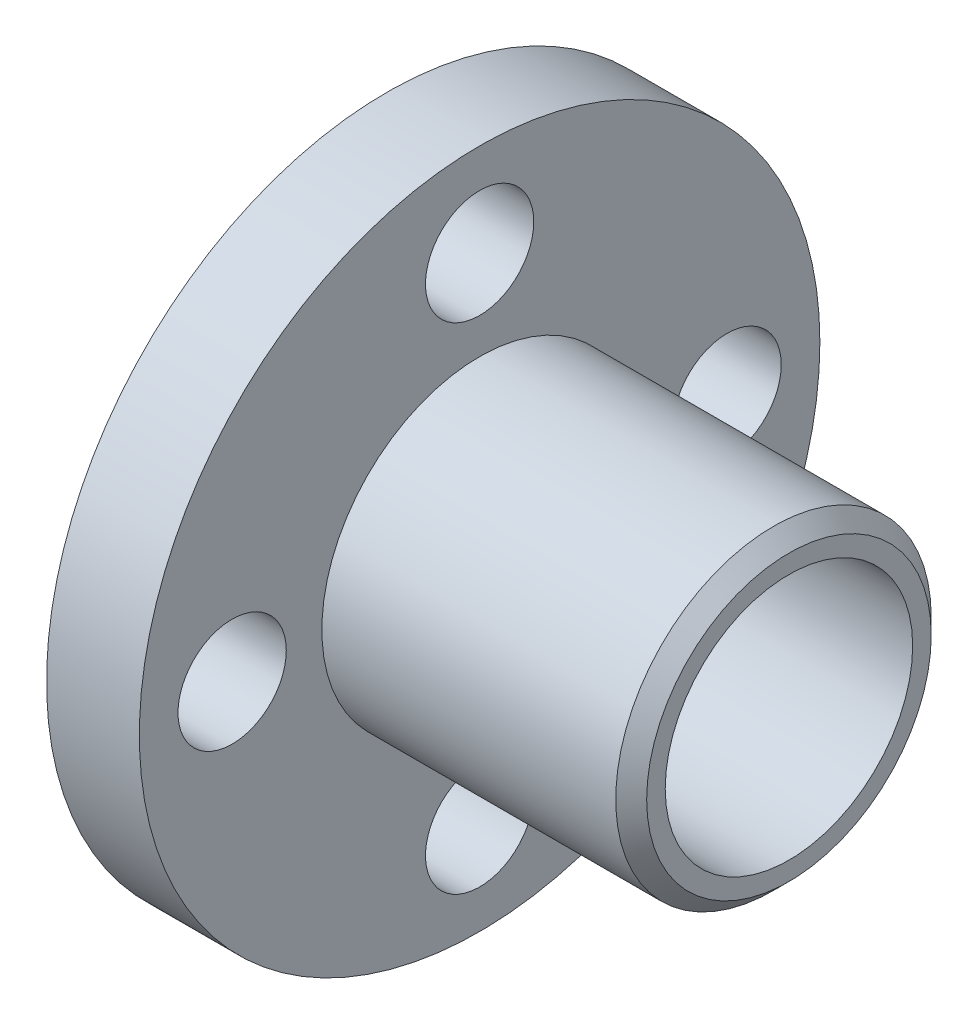
ISO-10303-21;
HEADER;
FILE_DESCRIPTION(('STEP AP214'),'2;1');
FILE_NAME('part.step','',(''),(''),'','','');
FILE_SCHEMA(('AUTOMOTIVE_DESIGN { 1 0 10303 214 1 1 1 1 }'));
ENDSEC;
DATA;
#1=APPLICATION_CONTEXT('core data for automotive mechanical design processes');
#2=APPLICATION_PROTOCOL_DEFINITION('international standard','automotive_design',2000,#1);
#3=PRODUCT_CONTEXT('',#1,'mechanical');
#4=PRODUCT('Part','Part','',(#3));
#5=PRODUCT_RELATED_PRODUCT_CATEGORY('part','',(#4));
#6=PRODUCT_DEFINITION_FORMATION('','',#4);
#7=PRODUCT_DEFINITION_CONTEXT('part definition',#1,'design');
#8=PRODUCT_DEFINITION('design','',#6,#7);
#9=PRODUCT_DEFINITION_SHAPE('','',#8);
#10=(LENGTH_UNIT() NAMED_UNIT(*) SI_UNIT(.MILLI.,.METRE.));
#11=(NAMED_UNIT(*) PLANE_ANGLE_UNIT() SI_UNIT($,.RADIAN.));
#12=(NAMED_UNIT(*) SI_UNIT($,.STERADIAN.) SOLID_ANGLE_UNIT());
#13=UNCERTAINTY_MEASURE_WITH_UNIT(LENGTH_MEASURE(1.E-05),#10,'distance_accuracy_value','');
#14=(GEOMETRIC_REPRESENTATION_CONTEXT(3) GLOBAL_UNCERTAINTY_ASSIGNED_CONTEXT((#13)) GLOBAL_UNIT_ASSIGNED_CONTEXT((#10,
#11,#12)) REPRESENTATION_CONTEXT('',''));
#15=CARTESIAN_POINT('',(0.,0.,0.));
#16=DIRECTION('',(0.,0.,1.));
#17=DIRECTION('',(1.,0.,0.));
#18=AXIS2_PLACEMENT_3D('',#15,#16,#17);
#19=CARTESIAN_POINT('',(0.,0.,0.));
#20=DIRECTION('',(1.,0.,0.));
#21=DIRECTION('',(0.,0.,-1.));
#22=AXIS2_PLACEMENT_3D('',#19,#20,#21);
#23=PLANE('',#22);
#24=CARTESIAN_POINT('',(0.,-2.27373675443232E-13,7.99999999999977));
#25=DIRECTION('',(1.,0.,0.));
#26=DIRECTION('',(0.,0.,-1.));
#27=AXIS2_PLACEMENT_3D('',#24,#25,#26);
#28=CIRCLE('',#27,1.75000000000037);
#29=CARTESIAN_POINT('',(0.,-2.27373675443232E-13,6.24999999999941));
#30=VERTEX_POINT('',#29);
#31=EDGE_CURVE('E72',#30,#30,#28,.T.);
#32=ORIENTED_EDGE('',*,*,#31,.T.);
#33=EDGE_LOOP('',(#32));
#34=FACE_BOUND('',#33,.T.);
#35=CARTESIAN_POINT('',(0.,2.26393958003914E-13,-8.00000000000023));
#36=DIRECTION('',(1.,0.,0.));
#37=DIRECTION('',(0.,0.,-1.));
#38=AXIS2_PLACEMENT_3D('',#35,#36,#37);
#39=CIRCLE('',#38,1.75000000000018);
#40=CARTESIAN_POINT('',(0.,2.26393958003914E-13,-9.75000000000041));
#41=VERTEX_POINT('',#40);
#42=EDGE_CURVE('E60',#41,#41,#39,.T.);
#43=ORIENTED_EDGE('',*,*,#42,.T.);
#44=EDGE_LOOP('',(#43));
#45=FACE_BOUND('',#44,.T.);
#46=CARTESIAN_POINT('',(0.,0.,0.));
#47=DIRECTION('',(1.,0.,0.));
#48=DIRECTION('',(0.,0.,-1.));
#49=AXIS2_PLACEMENT_3D('',#46,#47,#48);
#50=CIRCLE('',#49,11.);
#51=CARTESIAN_POINT('',(0.,0.,-11.));
#52=VERTEX_POINT('',#51);
#53=EDGE_CURVE('E48',#52,#52,#50,.T.);
#54=ORIENTED_EDGE('',*,*,#53,.F.);
#55=EDGE_LOOP('',(#54));
#56=FACE_BOUND('',#55,.T.);
#57=CARTESIAN_POINT('',(0.,8.,0.));
#58=DIRECTION('',(1.,0.,0.));
#59=DIRECTION('',(0.,0.,-1.));
#60=AXIS2_PLACEMENT_3D('',#57,#58,#59);
#61=CIRCLE('',#60,1.75);
#62=CARTESIAN_POINT('',(0.,8.,-1.75));
#63=VERTEX_POINT('',#62);
#64=EDGE_CURVE('E54',#63,#63,#61,.T.);
#65=ORIENTED_EDGE('',*,*,#64,.T.);
#66=EDGE_LOOP('',(#65));
#67=FACE_BOUND('',#66,.T.);
#68=CARTESIAN_POINT('',(0.,-8.,-4.53155310047573E-13));
#69=DIRECTION('',(1.,0.,0.));
#70=DIRECTION('',(0.,0.,-1.));
#71=AXIS2_PLACEMENT_3D('',#68,#69,#70);
#72=CIRCLE('',#71,1.75000000000049);
#73=CARTESIAN_POINT('',(0.,-8.,-1.75000000000094));
#74=VERTEX_POINT('',#73);
#75=EDGE_CURVE('E66',#74,#74,#72,.T.);
#76=ORIENTED_EDGE('',*,*,#75,.T.);
#77=EDGE_LOOP('',(#76));
#78=FACE_BOUND('',#77,.T.);
#79=CARTESIAN_POINT('',(0.,0.,0.));
#80=DIRECTION('',(1.,0.,0.));
#81=DIRECTION('',(0.,0.,-1.));
#82=AXIS2_PLACEMENT_3D('',#79,#80,#81);
#83=CIRCLE('',#82,5.1);
#84=CARTESIAN_POINT('',(0.,0.,-5.1));
#85=VERTEX_POINT('',#84);
#86=EDGE_CURVE('E10',#85,#85,#83,.F.);
#87=ORIENTED_EDGE('',*,*,#86,.F.);
#88=EDGE_LOOP('',(#87));
#89=FACE_BOUND('',#88,.T.);
#90=ADVANCED_FACE('F30',(#34,#45,#56,#67,#78,#89),#23,.F.);
#91=CARTESIAN_POINT('',(3.,0.,0.));
#92=DIRECTION('',(1.,0.,0.));
#93=DIRECTION('',(0.,0.,-1.));
#94=AXIS2_PLACEMENT_3D('',#91,#92,#93);
#95=PLANE('',#94);
#96=CARTESIAN_POINT('',(3.,-2.27373675443232E-13,7.99999999999977));
#97=DIRECTION('',(1.,0.,0.));
#98=DIRECTION('',(0.,0.,-1.));
#99=AXIS2_PLACEMENT_3D('',#96,#97,#98);
#100=CIRCLE('',#99,1.75000000000037);
#101=CARTESIAN_POINT('',(3.,-2.27373675443232E-13,6.24999999999941));
#102=VERTEX_POINT('',#101);
#103=EDGE_CURVE('E69',#102,#102,#100,.T.);
#104=ORIENTED_EDGE('',*,*,#103,.F.);
#105=EDGE_LOOP('',(#104));
#106=FACE_BOUND('',#105,.T.);
#107=CARTESIAN_POINT('',(3.,2.26393958003914E-13,-8.00000000000023));
#108=DIRECTION('',(1.,0.,0.));
#109=DIRECTION('',(0.,0.,-1.));
#110=AXIS2_PLACEMENT_3D('',#107,#108,#109);
#111=CIRCLE('',#110,1.75000000000018);
#112=CARTESIAN_POINT('',(3.,2.26393958003914E-13,-9.75000000000041));
#113=VERTEX_POINT('',#112);
#114=EDGE_CURVE('E57',#113,#113,#111,.T.);
#115=ORIENTED_EDGE('',*,*,#114,.F.);
#116=EDGE_LOOP('',(#115));
#117=FACE_BOUND('',#116,.T.);
#118=CARTESIAN_POINT('',(3.,0.,0.));
#119=DIRECTION('',(1.,0.,0.));
#120=DIRECTION('',(0.,0.,-1.));
#121=AXIS2_PLACEMENT_3D('',#118,#119,#120);
#122=CIRCLE('',#121,11.);
#123=CARTESIAN_POINT('',(3.,0.,-11.));
#124=VERTEX_POINT('',#123);
#125=EDGE_CURVE('E45',#124,#124,#122,.T.);
#126=ORIENTED_EDGE('',*,*,#125,.T.);
#127=EDGE_LOOP('',(#126));
#128=FACE_BOUND('',#127,.T.);
#129=CARTESIAN_POINT('',(3.,8.,0.));
#130=DIRECTION('',(1.,0.,0.));
#131=DIRECTION('',(0.,0.,-1.));
#132=AXIS2_PLACEMENT_3D('',#129,#130,#131);
#133=CIRCLE('',#132,1.75);
#134=CARTESIAN_POINT('',(3.,8.,-1.75));
#135=VERTEX_POINT('',#134);
#136=EDGE_CURVE('E51',#135,#135,#133,.T.);
#137=ORIENTED_EDGE('',*,*,#136,.F.);
#138=EDGE_LOOP('',(#137));
#139=FACE_BOUND('',#138,.T.);
#140=CARTESIAN_POINT('',(3.,-8.,-4.53155310047573E-13));
#141=DIRECTION('',(1.,0.,0.));
#142=DIRECTION('',(0.,0.,-1.));
#143=AXIS2_PLACEMENT_3D('',#140,#141,#142);
#144=CIRCLE('',#143,1.75000000000049);
#145=CARTESIAN_POINT('',(3.,-8.,-1.75000000000094));
#146=VERTEX_POINT('',#145);
#147=EDGE_CURVE('E63',#146,#146,#144,.T.);
#148=ORIENTED_EDGE('',*,*,#147,.F.);
#149=EDGE_LOOP('',(#148));
#150=FACE_BOUND('',#149,.T.);
#151=CARTESIAN_POINT('',(3.,0.,0.));
#152=DIRECTION('',(1.,0.,0.));
#153=DIRECTION('',(0.,0.,-1.));
#154=AXIS2_PLACEMENT_3D('',#151,#152,#153);
#155=CIRCLE('',#154,5.1);
#156=CARTESIAN_POINT('',(3.,0.,-5.1));
#157=VERTEX_POINT('',#156);
#158=EDGE_CURVE('E75',#157,#157,#155,.T.);
#159=ORIENTED_EDGE('',*,*,#158,.F.);
#160=EDGE_LOOP('',(#159));
#161=FACE_BOUND('',#160,.T.);
#162=ADVANCED_FACE('F115',(#106,#117,#128,#139,#150,#161),#95,.T.);
#163=CARTESIAN_POINT('',(3.,0.,0.));
#164=DIRECTION('',(-1.,0.,0.));
#165=DIRECTION('',(0.,0.,1.));
#166=AXIS2_PLACEMENT_3D('',#163,#164,#165);
#167=CYLINDRICAL_SURFACE('',#166,11.);
#168=ORIENTED_EDGE('',*,*,#125,.F.);
#169=EDGE_LOOP('',(#168));
#170=FACE_BOUND('',#169,.T.);
#171=ORIENTED_EDGE('',*,*,#53,.T.);
#172=EDGE_LOOP('',(#171));
#173=FACE_BOUND('',#172,.T.);
#174=ADVANCED_FACE('F121',(#170,#173),#167,.T.);
#175=CARTESIAN_POINT('',(3.,8.,0.));
#176=DIRECTION('',(-1.,0.,0.));
#177=DIRECTION('',(0.,0.,1.));
#178=AXIS2_PLACEMENT_3D('',#175,#176,#177);
#179=CYLINDRICAL_SURFACE('',#178,1.75);
#180=ORIENTED_EDGE('',*,*,#136,.T.);
#181=EDGE_LOOP('',(#180));
#182=FACE_BOUND('',#181,.T.);
#183=ORIENTED_EDGE('',*,*,#64,.F.);
#184=EDGE_LOOP('',(#183));
#185=FACE_BOUND('',#184,.T.);
#186=ADVANCED_FACE('F127',(#182,#185),#179,.F.);
#187=CARTESIAN_POINT('',(3.,2.26393958003914E-13,-8.00000000000023));
#188=DIRECTION('',(-1.,0.,0.));
#189=DIRECTION('',(0.,0.,1.));
#190=AXIS2_PLACEMENT_3D('',#187,#188,#189);
#191=CYLINDRICAL_SURFACE('',#190,1.75000000000018);
#192=ORIENTED_EDGE('',*,*,#114,.T.);
#193=EDGE_LOOP('',(#192));
#194=FACE_BOUND('',#193,.T.);
#195=ORIENTED_EDGE('',*,*,#42,.F.);
#196=EDGE_LOOP('',(#195));
#197=FACE_BOUND('',#196,.T.);
#198=ADVANCED_FACE('F132',(#194,#197),#191,.F.);
#199=CARTESIAN_POINT('',(3.,-8.,-4.53155310047573E-13));
#200=DIRECTION('',(-1.,0.,0.));
#201=DIRECTION('',(0.,0.,1.));
#202=AXIS2_PLACEMENT_3D('',#199,#200,#201);
#203=CYLINDRICAL_SURFACE('',#202,1.75000000000049);
#204=ORIENTED_EDGE('',*,*,#147,.T.);
#205=EDGE_LOOP('',(#204));
#206=FACE_BOUND('',#205,.T.);
#207=ORIENTED_EDGE('',*,*,#75,.F.);
#208=EDGE_LOOP('',(#207));
#209=FACE_BOUND('',#208,.T.);
#210=ADVANCED_FACE('F144',(#206,#209),#203,.F.);
#211=CARTESIAN_POINT('',(3.,-2.27373675443232E-13,7.99999999999977));
#212=DIRECTION('',(-1.,0.,0.));
#213=DIRECTION('',(0.,0.,1.));
#214=AXIS2_PLACEMENT_3D('',#211,#212,#213);
#215=CYLINDRICAL_SURFACE('',#214,1.75000000000037);
#216=ORIENTED_EDGE('',*,*,#103,.T.);
#217=EDGE_LOOP('',(#216));
#218=FACE_BOUND('',#217,.T.);
#219=ORIENTED_EDGE('',*,*,#31,.F.);
#220=EDGE_LOOP('',(#219));
#221=FACE_BOUND('',#220,.T.);
#222=ADVANCED_FACE('F146',(#218,#221),#215,.F.);
#223=CARTESIAN_POINT('',(13.,0.,0.));
#224=DIRECTION('',(-1.,0.,0.));
#225=DIRECTION('',(0.,0.,1.));
#226=AXIS2_PLACEMENT_3D('',#223,#224,#225);
#227=CYLINDRICAL_SURFACE('',#226,5.1);
#228=CARTESIAN_POINT('',(12.5,0.,0.));
#229=DIRECTION('',(1.,0.,0.));
#230=DIRECTION('',(0.,0.,-1.));
#231=AXIS2_PLACEMENT_3D('',#228,#229,#230);
#232=CIRCLE('',#231,5.1);
#233=CARTESIAN_POINT('',(12.5,0.,-5.1));
#234=VERTEX_POINT('',#233);
#235=EDGE_CURVE('E37',#234,#234,#232,.F.);
#236=ORIENTED_EDGE('',*,*,#235,.T.);
#237=EDGE_LOOP('',(#236));
#238=FACE_BOUND('',#237,.T.);
#239=ORIENTED_EDGE('',*,*,#158,.T.);
#240=EDGE_LOOP('',(#239));
#241=FACE_BOUND('',#240,.T.);
#242=ADVANCED_FACE('F102',(#238,#241),#227,.T.);
#243=CARTESIAN_POINT('',(13.,0.,0.));
#244=DIRECTION('',(1.,0.,0.));
#245=DIRECTION('',(0.,0.,-1.));
#246=AXIS2_PLACEMENT_3D('',#243,#244,#245);
#247=PLANE('',#246);
#248=CARTESIAN_POINT('',(13.,0.,0.));
#249=DIRECTION('',(1.,0.,0.));
#250=DIRECTION('',(0.,0.,-1.));
#251=AXIS2_PLACEMENT_3D('',#248,#249,#250);
#252=CIRCLE('',#251,4.);
#253=CARTESIAN_POINT('',(13.,0.,-4.));
#254=VERTEX_POINT('',#253);
#255=EDGE_CURVE('E84',#254,#254,#252,.T.);
#256=ORIENTED_EDGE('',*,*,#255,.F.);
#257=EDGE_LOOP('',(#256));
#258=FACE_BOUND('',#257,.T.);
#259=CARTESIAN_POINT('',(13.,0.,0.));
#260=DIRECTION('',(1.,0.,0.));
#261=DIRECTION('',(0.,0.,-1.));
#262=AXIS2_PLACEMENT_3D('',#259,#260,#261);
#263=CIRCLE('',#262,4.6);
#264=CARTESIAN_POINT('',(13.,0.,-4.6));
#265=VERTEX_POINT('',#264);
#266=EDGE_CURVE('E41',#265,#265,#263,.T.);
#267=ORIENTED_EDGE('',*,*,#266,.T.);
#268=EDGE_LOOP('',(#267));
#269=FACE_BOUND('',#268,.T.);
#270=ADVANCED_FACE('F99',(#258,#269),#247,.T.);
#271=CARTESIAN_POINT('',(13.,0.,0.));
#272=DIRECTION('',(-1.,0.,0.));
#273=DIRECTION('',(0.,0.,1.));
#274=AXIS2_PLACEMENT_3D('',#271,#272,#273);
#275=CONICAL_SURFACE('',#274,4.6,0.785398163397444);
#276=ORIENTED_EDGE('',*,*,#235,.F.);
#277=EDGE_LOOP('',(#276));
#278=FACE_BOUND('',#277,.T.);
#279=ORIENTED_EDGE('',*,*,#266,.F.);
#280=EDGE_LOOP('',(#279));
#281=FACE_BOUND('',#280,.T.);
#282=ADVANCED_FACE('F32',(#278,#281),#275,.T.);
#283=CARTESIAN_POINT('',(-1.5,0.,0.));
#284=DIRECTION('',(1.,0.,0.));
#285=DIRECTION('',(0.,0.,-1.));
#286=AXIS2_PLACEMENT_3D('',#283,#284,#285);
#287=CYLINDRICAL_SURFACE('',#286,5.1);
#288=CARTESIAN_POINT('',(-1.5,0.,0.));
#289=DIRECTION('',(-1.,0.,0.));
#290=DIRECTION('',(0.,0.,1.));
#291=AXIS2_PLACEMENT_3D('',#288,#289,#290);
#292=CIRCLE('',#291,5.1);
#293=CARTESIAN_POINT('',(-1.5,0.,5.1));
#294=VERTEX_POINT('',#293);
#295=EDGE_CURVE('E80',#294,#294,#292,.T.);
#296=ORIENTED_EDGE('',*,*,#295,.F.);
#297=EDGE_LOOP('',(#296));
#298=FACE_BOUND('',#297,.T.);
#299=ORIENTED_EDGE('',*,*,#86,.T.);
#300=EDGE_LOOP('',(#299));
#301=FACE_BOUND('',#300,.T.);
#302=ADVANCED_FACE('F107',(#298,#301),#287,.T.);
#303=CARTESIAN_POINT('',(-1.5,0.,0.));
#304=DIRECTION('',(-1.,0.,0.));
#305=DIRECTION('',(0.,0.,1.));
#306=AXIS2_PLACEMENT_3D('',#303,#304,#305);
#307=PLANE('',#306);
#308=CARTESIAN_POINT('',(-1.5,0.,0.));
#309=DIRECTION('',(1.,0.,0.));
#310=DIRECTION('',(0.,0.,-1.));
#311=AXIS2_PLACEMENT_3D('',#308,#309,#310);
#312=CIRCLE('',#311,4.);
#313=CARTESIAN_POINT('',(-1.5,0.,-4.));
#314=VERTEX_POINT('',#313);
#315=EDGE_CURVE('E83',#314,#314,#312,.T.);
#316=ORIENTED_EDGE('',*,*,#315,.T.);
#317=EDGE_LOOP('',(#316));
#318=FACE_BOUND('',#317,.T.);
#319=ORIENTED_EDGE('',*,*,#295,.T.);
#320=EDGE_LOOP('',(#319));
#321=FACE_BOUND('',#320,.T.);
#322=ADVANCED_FACE('F90',(#318,#321),#307,.T.);
#323=CARTESIAN_POINT('',(-1.5,0.,0.));
#324=DIRECTION('',(1.,0.,0.));
#325=DIRECTION('',(0.,0.,-1.));
#326=AXIS2_PLACEMENT_3D('',#323,#324,#325);
#327=CYLINDRICAL_SURFACE('',#326,4.);
#328=CARTESIAN_POINT('',(-1.5,0.,-4.));
#329=CARTESIAN_POINT('',(-1.34895833333333,0.,-4.));
#330=CARTESIAN_POINT('',(-1.19791666666667,0.,-4.));
#331=CARTESIAN_POINT('',(-0.895833333333333,0.,-4.));
#332=CARTESIAN_POINT('',(-0.744791666666666,0.,-4.));
#333=CARTESIAN_POINT('',(-0.442708333333333,0.,-4.));
#334=CARTESIAN_POINT('',(-0.291666666666666,0.,-4.));
#335=CARTESIAN_POINT('',(0.010416666666667,0.,-4.));
#336=CARTESIAN_POINT('',(0.161458333333334,0.,-4.));
#337=CARTESIAN_POINT('',(0.463541666666667,0.,-4.));
#338=CARTESIAN_POINT('',(0.614583333333334,0.,-4.));
#339=CARTESIAN_POINT('',(0.916666666666667,0.,-4.));
#340=CARTESIAN_POINT('',(1.06770833333333,0.,-4.));
#341=CARTESIAN_POINT('',(1.36979166666667,0.,-4.));
#342=CARTESIAN_POINT('',(1.52083333333333,0.,-4.));
#343=CARTESIAN_POINT('',(1.82291666666667,0.,-4.));
#344=CARTESIAN_POINT('',(1.97395833333333,0.,-4.));
#345=CARTESIAN_POINT('',(2.27604166666667,0.,-4.));
#346=CARTESIAN_POINT('',(2.42708333333333,0.,-4.));
#347=CARTESIAN_POINT('',(2.72916666666667,0.,-4.));
#348=CARTESIAN_POINT('',(2.88020833333333,0.,-4.));
#349=CARTESIAN_POINT('',(3.18229166666667,0.,-4.));
#350=CARTESIAN_POINT('',(3.33333333333333,0.,-4.));
#351=CARTESIAN_POINT('',(3.63541666666667,0.,-4.));
#352=CARTESIAN_POINT('',(3.78645833333333,0.,-4.));
#353=CARTESIAN_POINT('',(4.08854166666667,0.,-4.));
#354=CARTESIAN_POINT('',(4.23958333333333,0.,-4.));
#355=CARTESIAN_POINT('',(4.54166666666667,0.,-4.));
#356=CARTESIAN_POINT('',(4.69270833333333,0.,-4.));
#357=CARTESIAN_POINT('',(4.99479166666667,0.,-4.));
#358=CARTESIAN_POINT('',(5.14583333333333,0.,-4.));
#359=CARTESIAN_POINT('',(5.44791666666667,0.,-4.));
#360=CARTESIAN_POINT('',(5.59895833333333,0.,-4.));
#361=CARTESIAN_POINT('',(5.90104166666667,0.,-4.));
#362=CARTESIAN_POINT('',(6.05208333333333,0.,-4.));
#363=CARTESIAN_POINT('',(6.35416666666667,0.,-4.));
#364=CARTESIAN_POINT('',(6.50520833333333,0.,-4.));
#365=CARTESIAN_POINT('',(6.80729166666667,0.,-4.));
#366=CARTESIAN_POINT('',(6.95833333333333,0.,-4.));
#367=CARTESIAN_POINT('',(7.26041666666667,0.,-4.));
#368=CARTESIAN_POINT('',(7.41145833333333,0.,-4.));
#369=CARTESIAN_POINT('',(7.71354166666667,0.,-4.));
#370=CARTESIAN_POINT('',(7.86458333333333,0.,-4.));
#371=CARTESIAN_POINT('',(8.16666666666667,0.,-4.));
#372=CARTESIAN_POINT('',(8.31770833333333,0.,-4.));
#373=CARTESIAN_POINT('',(8.61979166666667,0.,-4.));
#374=CARTESIAN_POINT('',(8.77083333333333,0.,-4.));
#375=CARTESIAN_POINT('',(9.07291666666667,0.,-4.));
#376=CARTESIAN_POINT('',(9.22395833333333,0.,-4.));
#377=CARTESIAN_POINT('',(9.52604166666667,0.,-4.));
#378=CARTESIAN_POINT('',(9.67708333333333,0.,-4.));
#379=CARTESIAN_POINT('',(9.97916666666667,0.,-4.));
#380=CARTESIAN_POINT('',(10.1302083333333,0.,-4.));
#381=CARTESIAN_POINT('',(10.4322916666667,0.,-4.));
#382=CARTESIAN_POINT('',(10.5833333333333,0.,-4.));
#383=CARTESIAN_POINT('',(10.8854166666667,0.,-4.));
#384=CARTESIAN_POINT('',(11.0364583333333,0.,-4.));
#385=CARTESIAN_POINT('',(11.3385416666667,0.,-4.));
#386=CARTESIAN_POINT('',(11.4895833333333,0.,-4.));
#387=CARTESIAN_POINT('',(11.7916666666667,0.,-4.));
#388=CARTESIAN_POINT('',(11.9427083333333,0.,-4.));
#389=CARTESIAN_POINT('',(12.2447916666667,0.,-4.));
#390=CARTESIAN_POINT('',(12.3958333333333,0.,-4.));
#391=CARTESIAN_POINT('',(12.6979166666667,0.,-4.));
#392=CARTESIAN_POINT('',(12.8489583333333,0.,-4.));
#393=CARTESIAN_POINT('',(13.,0.,-4.));
#394=B_SPLINE_CURVE_WITH_KNOTS('',3,(#328,#329,#330,#331,#332,#333,#334,#335,#336,#337,#338,
#339,#340,#341,#342,#343,#344,#345,#346,#347,#348,#349,#350,#351,#352,#353,#354,#355,#356,#357,
#358,#359,#360,#361,#362,#363,#364,#365,#366,#367,#368,#369,#370,#371,#372,#373,#374,#375,#376,
#377,#378,#379,#380,#381,#382,#383,#384,#385,#386,#387,#388,#389,#390,#391,#392,#393),
.UNSPECIFIED.,.F.,.F.,(4,2,2,2,2,2,2,2,2,2,2,2,2,2,2,2,2,2,2,2,2,2,2,2,2,2,2,2,2,2,2,2,4),(0.,
0.453125,0.90625,1.359375,1.8125,2.265625,2.71875,3.171875,3.625,4.078125,4.53125,4.984375,
5.4375,5.890625,6.34375,6.796875,7.25,7.703125,8.15625,8.609375,9.0625,9.515625,9.96875,
10.421875,10.875,11.328125,11.78125,12.234375,12.6875,13.140625,13.59375,14.046875,14.5),.UNSPECIFIED.);
#395=EDGE_CURVE('BSEAM93',#314,#254,#394,.T.);
#396=ORIENTED_EDGE('',*,*,#315,.F.);
#397=ORIENTED_EDGE('',*,*,#255,.T.);
#398=ORIENTED_EDGE('',*,*,#395,.T.);
#399=ORIENTED_EDGE('',*,*,#395,.F.);
#400=EDGE_LOOP('',(#396,#398,#397,#399));
#401=FACE_BOUND('',#400,.T.);
#402=ADVANCED_FACE('F93',(#401),#327,.F.);
#403=CLOSED_SHELL('',(#90,#162,#174,#186,#198,#210,#222,#242,#270,#282,#302,#322,#402));
#404=MANIFOLD_SOLID_BREP('B2',#403);
#405=ADVANCED_BREP_SHAPE_REPRESENTATION('',(#18,#404),#14);
#406=SHAPE_DEFINITION_REPRESENTATION(#9,#405);
ENDSEC;
END-ISO-10303-21;
